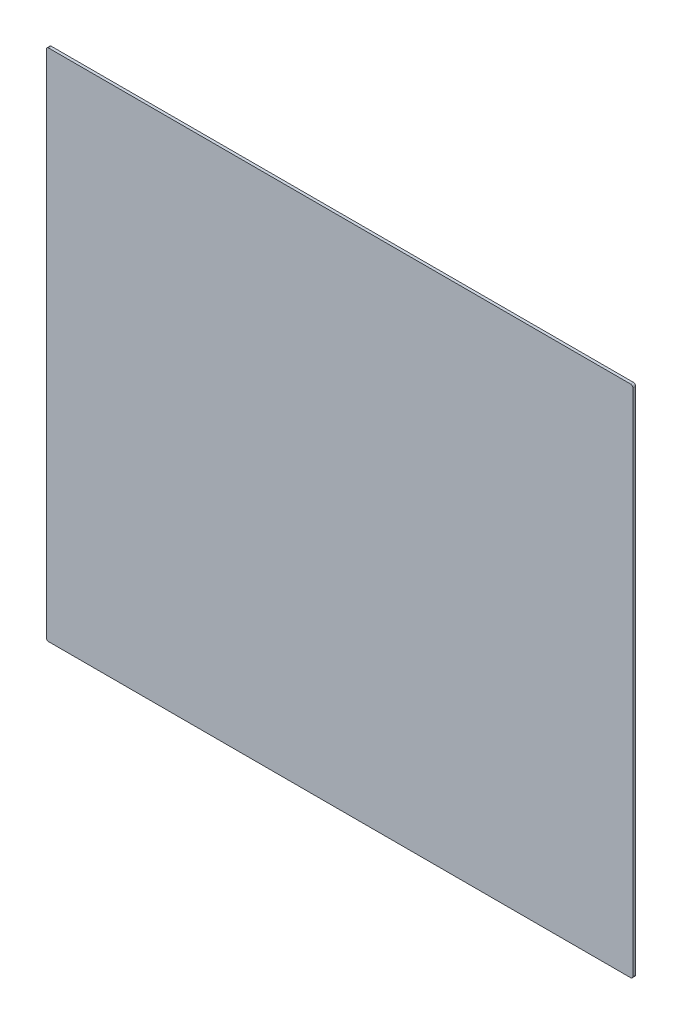
ISO-10303-21;
HEADER;
FILE_DESCRIPTION(('STEP AP214'),'2;1');
FILE_NAME('part.step','',(''),(''),'','','');
FILE_SCHEMA(('AUTOMOTIVE_DESIGN { 1 0 10303 214 1 1 1 1 }'));
ENDSEC;
DATA;
#1=APPLICATION_CONTEXT('core data for automotive mechanical design processes');
#2=APPLICATION_PROTOCOL_DEFINITION('international standard','automotive_design',2000,#1);
#3=PRODUCT_CONTEXT('',#1,'mechanical');
#4=PRODUCT('Part','Part','',(#3));
#5=PRODUCT_RELATED_PRODUCT_CATEGORY('part','',(#4));
#6=PRODUCT_DEFINITION_FORMATION('','',#4);
#7=PRODUCT_DEFINITION_CONTEXT('part definition',#1,'design');
#8=PRODUCT_DEFINITION('design','',#6,#7);
#9=PRODUCT_DEFINITION_SHAPE('','',#8);
#10=(LENGTH_UNIT() NAMED_UNIT(*) SI_UNIT(.MILLI.,.METRE.));
#11=(NAMED_UNIT(*) PLANE_ANGLE_UNIT() SI_UNIT($,.RADIAN.));
#12=(NAMED_UNIT(*) SI_UNIT($,.STERADIAN.) SOLID_ANGLE_UNIT());
#13=UNCERTAINTY_MEASURE_WITH_UNIT(LENGTH_MEASURE(1.E-05),#10,'distance_accuracy_value','');
#14=(GEOMETRIC_REPRESENTATION_CONTEXT(3) GLOBAL_UNCERTAINTY_ASSIGNED_CONTEXT((#13)) GLOBAL_UNIT_ASSIGNED_CONTEXT((#10,
#11,#12)) REPRESENTATION_CONTEXT('',''));
#15=CARTESIAN_POINT('',(0.,0.,0.));
#16=DIRECTION('',(0.,0.,1.));
#17=DIRECTION('',(1.,0.,0.));
#18=AXIS2_PLACEMENT_3D('',#15,#16,#17);
#19=CARTESIAN_POINT('',(-224.976704426795,260.726402714932,3.175));
#20=DIRECTION('',(0.,1.,0.));
#21=DIRECTION('',(0.,0.,1.));
#22=AXIS2_PLACEMENT_3D('',#19,#20,#21);
#23=PLANE('',#22);
#24=DIRECTION('',(1.,0.,0.));
#25=VECTOR('',#24,1.);
#26=CARTESIAN_POINT('',(-224.976704426795,260.726402714932,3.175));
#27=LINE('',#26,#25);
#28=CARTESIAN_POINT('',(-222.436704426795,260.726402714932,3.175));
#29=VERTEX_POINT('',#28);
#30=CARTESIAN_POINT('',(420.183295573205,260.726402714932,3.175));
#31=VERTEX_POINT('',#30);
#32=EDGE_CURVE('E138',#29,#31,#27,.T.);
#33=ORIENTED_EDGE('',*,*,#32,.T.);
#34=DIRECTION('',(0.,0.,-1.));
#35=VECTOR('',#34,1.);
#36=CARTESIAN_POINT('',(420.183295573205,260.726402714932,3.175));
#37=LINE('',#36,#35);
#38=CARTESIAN_POINT('',(420.183295573205,260.726402714932,0.));
#39=VERTEX_POINT('',#38);
#40=EDGE_CURVE('E11',#31,#39,#37,.T.);
#41=ORIENTED_EDGE('',*,*,#40,.T.);
#42=DIRECTION('',(1.,0.,0.));
#43=VECTOR('',#42,1.);
#44=CARTESIAN_POINT('',(-224.976704426795,260.726402714932,0.));
#45=LINE('',#44,#43);
#46=CARTESIAN_POINT('',(-222.436704426795,260.726402714932,0.));
#47=VERTEX_POINT('',#46);
#48=EDGE_CURVE('E140',#47,#39,#45,.T.);
#49=ORIENTED_EDGE('',*,*,#48,.F.);
#50=DIRECTION('',(0.,0.,-1.));
#51=VECTOR('',#50,1.);
#52=CARTESIAN_POINT('',(-222.436704426795,260.726402714932,3.175));
#53=LINE('',#52,#51);
#54=EDGE_CURVE('E51',#47,#29,#53,.F.);
#55=ORIENTED_EDGE('',*,*,#54,.T.);
#56=EDGE_LOOP('',(#33,#41,#49,#55));
#57=FACE_BOUND('',#56,.T.);
#58=ADVANCED_FACE('F43',(#57),#23,.T.);
#59=CARTESIAN_POINT('',(-224.976704426795,260.726402714932,3.175));
#60=DIRECTION('',(1.,0.,0.));
#61=DIRECTION('',(0.,1.,0.));
#62=AXIS2_PLACEMENT_3D('',#59,#60,#61);
#63=PLANE('',#62);
#64=DIRECTION('',(0.,-1.,0.));
#65=VECTOR('',#64,1.);
#66=CARTESIAN_POINT('',(-224.976704426795,260.726402714932,0.));
#67=LINE('',#66,#65);
#68=CARTESIAN_POINT('',(-224.976704426795,258.186402714932,0.));
#69=VERTEX_POINT('',#68);
#70=CARTESIAN_POINT('',(-224.976704426795,-304.423597285068,0.));
#71=VERTEX_POINT('',#70);
#72=EDGE_CURVE('E135',#69,#71,#67,.T.);
#73=ORIENTED_EDGE('',*,*,#72,.T.);
#74=DIRECTION('',(0.,0.,-1.));
#75=VECTOR('',#74,1.);
#76=CARTESIAN_POINT('',(-224.976704426795,-304.423597285068,3.175));
#77=LINE('',#76,#75);
#78=CARTESIAN_POINT('',(-224.976704426795,-304.423597285068,3.175));
#79=VERTEX_POINT('',#78);
#80=EDGE_CURVE('E115',#71,#79,#77,.F.);
#81=ORIENTED_EDGE('',*,*,#80,.T.);
#82=DIRECTION('',(0.,-1.,0.));
#83=VECTOR('',#82,1.);
#84=CARTESIAN_POINT('',(-224.976704426795,260.726402714932,3.175));
#85=LINE('',#84,#83);
#86=CARTESIAN_POINT('',(-224.976704426795,258.186402714932,3.175));
#87=VERTEX_POINT('',#86);
#88=EDGE_CURVE('E144',#87,#79,#85,.T.);
#89=ORIENTED_EDGE('',*,*,#88,.F.);
#90=DIRECTION('',(0.,0.,-1.));
#91=VECTOR('',#90,1.);
#92=CARTESIAN_POINT('',(-224.976704426795,258.186402714932,0.));
#93=LINE('',#92,#91);
#94=EDGE_CURVE('E120',#87,#69,#93,.T.);
#95=ORIENTED_EDGE('',*,*,#94,.T.);
#96=EDGE_LOOP('',(#73,#81,#89,#95));
#97=FACE_BOUND('',#96,.T.);
#98=ADVANCED_FACE('F180',(#97),#63,.F.);
#99=CARTESIAN_POINT('',(-224.976704426795,-306.963597285068,3.175));
#100=DIRECTION('',(0.,1.,0.));
#101=DIRECTION('',(0.,0.,1.));
#102=AXIS2_PLACEMENT_3D('',#99,#100,#101);
#103=PLANE('',#102);
#104=DIRECTION('',(1.,0.,0.));
#105=VECTOR('',#104,1.);
#106=CARTESIAN_POINT('',(-224.976704426795,-306.963597285068,3.175));
#107=LINE('',#106,#105);
#108=CARTESIAN_POINT('',(-222.436704426795,-306.963597285068,3.175));
#109=VERTEX_POINT('',#108);
#110=CARTESIAN_POINT('',(420.183295573205,-306.963597285068,3.175));
#111=VERTEX_POINT('',#110);
#112=EDGE_CURVE('E129',#109,#111,#107,.T.);
#113=ORIENTED_EDGE('',*,*,#112,.F.);
#114=DIRECTION('',(0.,0.,-1.));
#115=VECTOR('',#114,1.);
#116=CARTESIAN_POINT('',(-222.436704426795,-306.963597285068,3.175));
#117=LINE('',#116,#115);
#118=CARTESIAN_POINT('',(-222.436704426795,-306.963597285068,0.));
#119=VERTEX_POINT('',#118);
#120=EDGE_CURVE('E114',#109,#119,#117,.T.);
#121=ORIENTED_EDGE('',*,*,#120,.T.);
#122=DIRECTION('',(1.,0.,0.));
#123=VECTOR('',#122,1.);
#124=CARTESIAN_POINT('',(-224.976704426795,-306.963597285068,0.));
#125=LINE('',#124,#123);
#126=CARTESIAN_POINT('',(420.183295573205,-306.963597285068,0.));
#127=VERTEX_POINT('',#126);
#128=EDGE_CURVE('E127',#119,#127,#125,.T.);
#129=ORIENTED_EDGE('',*,*,#128,.T.);
#130=DIRECTION('',(0.,0.,-1.));
#131=VECTOR('',#130,1.);
#132=CARTESIAN_POINT('',(420.183295573205,-306.963597285068,3.175));
#133=LINE('',#132,#131);
#134=EDGE_CURVE('E131',#127,#111,#133,.F.);
#135=ORIENTED_EDGE('',*,*,#134,.T.);
#136=EDGE_LOOP('',(#113,#121,#129,#135));
#137=FACE_BOUND('',#136,.T.);
#138=ADVANCED_FACE('F126',(#137),#103,.F.);
#139=CARTESIAN_POINT('',(422.723295573205,260.726402714932,3.175));
#140=DIRECTION('',(1.,0.,0.));
#141=DIRECTION('',(0.,1.,0.));
#142=AXIS2_PLACEMENT_3D('',#139,#140,#141);
#143=PLANE('',#142);
#144=DIRECTION('',(0.,-1.,0.));
#145=VECTOR('',#144,1.);
#146=CARTESIAN_POINT('',(422.723295573205,260.726402714932,3.175));
#147=LINE('',#146,#145);
#148=CARTESIAN_POINT('',(422.723295573205,258.186402714932,3.175));
#149=VERTEX_POINT('',#148);
#150=CARTESIAN_POINT('',(422.723295573205,-304.423597285068,3.175));
#151=VERTEX_POINT('',#150);
#152=EDGE_CURVE('E176',#149,#151,#147,.T.);
#153=ORIENTED_EDGE('',*,*,#152,.T.);
#154=DIRECTION('',(0.,0.,-1.));
#155=VECTOR('',#154,1.);
#156=CARTESIAN_POINT('',(422.723295573205,-304.423597285068,0.));
#157=LINE('',#156,#155);
#158=CARTESIAN_POINT('',(422.723295573205,-304.423597285068,0.));
#159=VERTEX_POINT('',#158);
#160=EDGE_CURVE('E161',#151,#159,#157,.T.);
#161=ORIENTED_EDGE('',*,*,#160,.T.);
#162=DIRECTION('',(0.,-1.,0.));
#163=VECTOR('',#162,1.);
#164=CARTESIAN_POINT('',(422.723295573205,260.726402714932,0.));
#165=LINE('',#164,#163);
#166=CARTESIAN_POINT('',(422.723295573205,258.186402714932,0.));
#167=VERTEX_POINT('',#166);
#168=EDGE_CURVE('E136',#167,#159,#165,.T.);
#169=ORIENTED_EDGE('',*,*,#168,.F.);
#170=DIRECTION('',(0.,0.,-1.));
#171=VECTOR('',#170,1.);
#172=CARTESIAN_POINT('',(422.723295573205,258.186402714932,3.175));
#173=LINE('',#172,#171);
#174=EDGE_CURVE('E65',#167,#149,#173,.F.);
#175=ORIENTED_EDGE('',*,*,#174,.T.);
#176=EDGE_LOOP('',(#153,#161,#169,#175));
#177=FACE_BOUND('',#176,.T.);
#178=ADVANCED_FACE('F185',(#177),#143,.T.);
#179=CARTESIAN_POINT('',(0.,0.,3.175));
#180=DIRECTION('',(0.,0.,-1.));
#181=DIRECTION('',(-1.,0.,0.));
#182=AXIS2_PLACEMENT_3D('',#179,#180,#181);
#183=PLANE('',#182);
#184=ORIENTED_EDGE('',*,*,#88,.T.);
#185=CARTESIAN_POINT('',(-222.436704426795,-304.423597285068,3.175));
#186=DIRECTION('',(0.,0.,-1.));
#187=DIRECTION('',(-1.,0.,0.));
#188=AXIS2_PLACEMENT_3D('',#185,#186,#187);
#189=CIRCLE('',#188,2.54);
#190=EDGE_CURVE('E158',#79,#109,#189,.F.);
#191=ORIENTED_EDGE('',*,*,#190,.T.);
#192=ORIENTED_EDGE('',*,*,#112,.T.);
#193=CARTESIAN_POINT('',(420.183295573205,-304.423597285068,3.175));
#194=DIRECTION('',(0.,0.,-1.));
#195=DIRECTION('',(-1.,0.,0.));
#196=AXIS2_PLACEMENT_3D('',#193,#194,#195);
#197=CIRCLE('',#196,2.54);
#198=EDGE_CURVE('E58',#111,#151,#197,.F.);
#199=ORIENTED_EDGE('',*,*,#198,.T.);
#200=ORIENTED_EDGE('',*,*,#152,.F.);
#201=CARTESIAN_POINT('',(420.183295573205,258.186402714932,3.175));
#202=DIRECTION('',(0.,0.,-1.));
#203=DIRECTION('',(-1.,0.,0.));
#204=AXIS2_PLACEMENT_3D('',#201,#202,#203);
#205=CIRCLE('',#204,2.54);
#206=EDGE_CURVE('E155',#149,#31,#205,.F.);
#207=ORIENTED_EDGE('',*,*,#206,.T.);
#208=ORIENTED_EDGE('',*,*,#32,.F.);
#209=CARTESIAN_POINT('',(-222.436704426795,258.186402714932,3.175));
#210=DIRECTION('',(0.,0.,-1.));
#211=DIRECTION('',(-1.,0.,0.));
#212=AXIS2_PLACEMENT_3D('',#209,#210,#211);
#213=CIRCLE('',#212,2.54);
#214=EDGE_CURVE('E153',#29,#87,#213,.F.);
#215=ORIENTED_EDGE('',*,*,#214,.T.);
#216=EDGE_LOOP('',(#184,#191,#192,#199,#200,#207,#208,#215));
#217=FACE_BOUND('',#216,.T.);
#218=ADVANCED_FACE('F173',(#217),#183,.F.);
#219=CARTESIAN_POINT('',(0.,0.,0.));
#220=DIRECTION('',(0.,0.,-1.));
#221=DIRECTION('',(-1.,0.,0.));
#222=AXIS2_PLACEMENT_3D('',#219,#220,#221);
#223=PLANE('',#222);
#224=ORIENTED_EDGE('',*,*,#128,.F.);
#225=CARTESIAN_POINT('',(-222.436704426795,-304.423597285068,0.));
#226=DIRECTION('',(0.,0.,-1.));
#227=DIRECTION('',(-1.,0.,0.));
#228=AXIS2_PLACEMENT_3D('',#225,#226,#227);
#229=CIRCLE('',#228,2.54);
#230=EDGE_CURVE('E110',#119,#71,#229,.T.);
#231=ORIENTED_EDGE('',*,*,#230,.T.);
#232=ORIENTED_EDGE('',*,*,#72,.F.);
#233=CARTESIAN_POINT('',(-222.436704426795,258.186402714932,0.));
#234=DIRECTION('',(0.,0.,-1.));
#235=DIRECTION('',(-1.,0.,0.));
#236=AXIS2_PLACEMENT_3D('',#233,#234,#235);
#237=CIRCLE('',#236,2.54);
#238=EDGE_CURVE('E130',#69,#47,#237,.T.);
#239=ORIENTED_EDGE('',*,*,#238,.T.);
#240=ORIENTED_EDGE('',*,*,#48,.T.);
#241=CARTESIAN_POINT('',(420.183295573205,258.186402714932,0.));
#242=DIRECTION('',(0.,0.,-1.));
#243=DIRECTION('',(-1.,0.,0.));
#244=AXIS2_PLACEMENT_3D('',#241,#242,#243);
#245=CIRCLE('',#244,2.54);
#246=EDGE_CURVE('E147',#39,#167,#245,.T.);
#247=ORIENTED_EDGE('',*,*,#246,.T.);
#248=ORIENTED_EDGE('',*,*,#168,.T.);
#249=CARTESIAN_POINT('',(420.183295573205,-304.423597285068,0.));
#250=DIRECTION('',(0.,0.,-1.));
#251=DIRECTION('',(-1.,0.,0.));
#252=AXIS2_PLACEMENT_3D('',#249,#250,#251);
#253=CIRCLE('',#252,2.54);
#254=EDGE_CURVE('E121',#159,#127,#253,.T.);
#255=ORIENTED_EDGE('',*,*,#254,.T.);
#256=EDGE_LOOP('',(#224,#231,#232,#239,#240,#247,#248,#255));
#257=FACE_BOUND('',#256,.T.);
#258=ADVANCED_FACE('F133',(#257),#223,.T.);
#259=CARTESIAN_POINT('',(-222.436704426795,-304.423597285068,3.175));
#260=DIRECTION('',(0.,0.,-1.));
#261=DIRECTION('',(-1.,0.,0.));
#262=AXIS2_PLACEMENT_3D('',#259,#260,#261);
#263=CYLINDRICAL_SURFACE('',#262,2.54);
#264=ORIENTED_EDGE('',*,*,#190,.F.);
#265=ORIENTED_EDGE('',*,*,#80,.F.);
#266=ORIENTED_EDGE('',*,*,#230,.F.);
#267=ORIENTED_EDGE('',*,*,#120,.F.);
#268=EDGE_LOOP('',(#264,#265,#266,#267));
#269=FACE_BOUND('',#268,.T.);
#270=ADVANCED_FACE('F113',(#269),#263,.T.);
#271=CARTESIAN_POINT('',(420.183295573205,-304.423597285068,3.175));
#272=DIRECTION('',(0.,0.,1.));
#273=DIRECTION('',(1.,0.,0.));
#274=AXIS2_PLACEMENT_3D('',#271,#272,#273);
#275=CYLINDRICAL_SURFACE('',#274,2.54);
#276=ORIENTED_EDGE('',*,*,#198,.F.);
#277=ORIENTED_EDGE('',*,*,#134,.F.);
#278=ORIENTED_EDGE('',*,*,#254,.F.);
#279=ORIENTED_EDGE('',*,*,#160,.F.);
#280=EDGE_LOOP('',(#276,#277,#278,#279));
#281=FACE_BOUND('',#280,.T.);
#282=ADVANCED_FACE('F187',(#281),#275,.T.);
#283=CARTESIAN_POINT('',(420.183295573205,258.186402714932,3.175));
#284=DIRECTION('',(0.,0.,-1.));
#285=DIRECTION('',(-1.,0.,0.));
#286=AXIS2_PLACEMENT_3D('',#283,#284,#285);
#287=CYLINDRICAL_SURFACE('',#286,2.54);
#288=ORIENTED_EDGE('',*,*,#206,.F.);
#289=ORIENTED_EDGE('',*,*,#174,.F.);
#290=ORIENTED_EDGE('',*,*,#246,.F.);
#291=ORIENTED_EDGE('',*,*,#40,.F.);
#292=EDGE_LOOP('',(#288,#289,#290,#291));
#293=FACE_BOUND('',#292,.T.);
#294=ADVANCED_FACE('F189',(#293),#287,.T.);
#295=CARTESIAN_POINT('',(-222.436704426795,258.186402714932,3.175));
#296=DIRECTION('',(0.,0.,1.));
#297=DIRECTION('',(1.,0.,0.));
#298=AXIS2_PLACEMENT_3D('',#295,#296,#297);
#299=CYLINDRICAL_SURFACE('',#298,2.54);
#300=ORIENTED_EDGE('',*,*,#214,.F.);
#301=ORIENTED_EDGE('',*,*,#54,.F.);
#302=ORIENTED_EDGE('',*,*,#238,.F.);
#303=ORIENTED_EDGE('',*,*,#94,.F.);
#304=EDGE_LOOP('',(#300,#301,#302,#303));
#305=FACE_BOUND('',#304,.T.);
#306=ADVANCED_FACE('F45',(#305),#299,.T.);
#307=CLOSED_SHELL('',(#58,#98,#138,#178,#218,#258,#270,#282,#294,#306));
#308=MANIFOLD_SOLID_BREP('B2',#307);
#309=ADVANCED_BREP_SHAPE_REPRESENTATION('',(#18,#308),#14);
#310=SHAPE_DEFINITION_REPRESENTATION(#9,#309);
ENDSEC;
END-ISO-10303-21;
